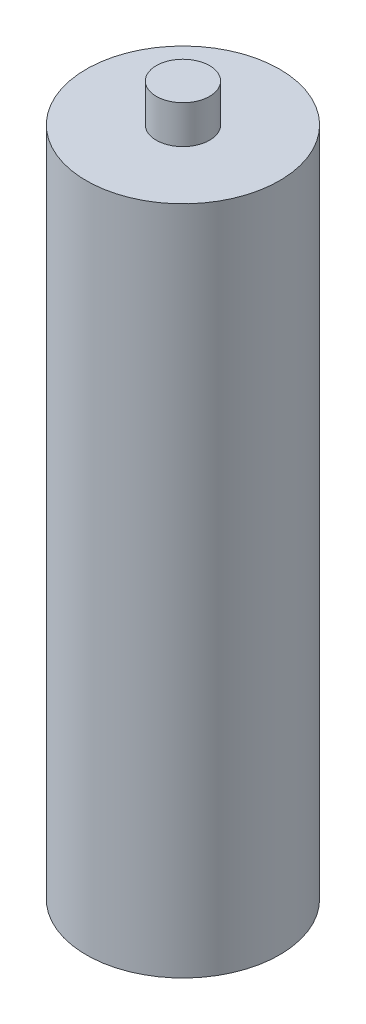
ISO-10303-21;
HEADER;
FILE_DESCRIPTION(('STEP AP214'),'2;1');
FILE_NAME('part.step','',(''),(''),'','','');
FILE_SCHEMA(('AUTOMOTIVE_DESIGN { 1 0 10303 214 1 1 1 1 }'));
ENDSEC;
DATA;
#1=APPLICATION_CONTEXT('core data for automotive mechanical design processes');
#2=APPLICATION_PROTOCOL_DEFINITION('international standard','automotive_design',2000,#1);
#3=PRODUCT_CONTEXT('',#1,'mechanical');
#4=PRODUCT('Part','Part','',(#3));
#5=PRODUCT_RELATED_PRODUCT_CATEGORY('part','',(#4));
#6=PRODUCT_DEFINITION_FORMATION('','',#4);
#7=PRODUCT_DEFINITION_CONTEXT('part definition',#1,'design');
#8=PRODUCT_DEFINITION('design','',#6,#7);
#9=PRODUCT_DEFINITION_SHAPE('','',#8);
#10=(LENGTH_UNIT() NAMED_UNIT(*) SI_UNIT(.MILLI.,.METRE.));
#11=(NAMED_UNIT(*) PLANE_ANGLE_UNIT() SI_UNIT($,.RADIAN.));
#12=(NAMED_UNIT(*) SI_UNIT($,.STERADIAN.) SOLID_ANGLE_UNIT());
#13=UNCERTAINTY_MEASURE_WITH_UNIT(LENGTH_MEASURE(1.E-05),#10,'distance_accuracy_value','');
#14=(GEOMETRIC_REPRESENTATION_CONTEXT(3) GLOBAL_UNCERTAINTY_ASSIGNED_CONTEXT((#13)) GLOBAL_UNIT_ASSIGNED_CONTEXT((#10,
#11,#12)) REPRESENTATION_CONTEXT('',''));
#15=CARTESIAN_POINT('',(0.,0.,0.));
#16=DIRECTION('',(0.,0.,1.));
#17=DIRECTION('',(1.,0.,0.));
#18=AXIS2_PLACEMENT_3D('',#15,#16,#17);
#19=CARTESIAN_POINT('',(0.,352.425,0.));
#20=DIRECTION('',(0.,-1.,0.));
#21=DIRECTION('',(0.,0.,-1.));
#22=AXIS2_PLACEMENT_3D('',#19,#20,#21);
#23=CYLINDRICAL_SURFACE('',#22,50.8);
#24=CARTESIAN_POINT('',(0.,352.425,0.));
#25=DIRECTION('',(0.,1.,0.));
#26=DIRECTION('',(0.,0.,1.));
#27=AXIS2_PLACEMENT_3D('',#24,#25,#26);
#28=CIRCLE('',#27,50.8);
#29=CARTESIAN_POINT('',(0.,352.425,-50.8));
#30=VERTEX_POINT('',#29);
#31=EDGE_CURVE('E53',#30,#30,#28,.T.);
#32=CARTESIAN_POINT('',(0.,0.,0.));
#33=DIRECTION('',(0.,1.,0.));
#34=DIRECTION('',(0.,0.,1.));
#35=AXIS2_PLACEMENT_3D('',#32,#33,#34);
#36=CIRCLE('',#35,50.8);
#37=CARTESIAN_POINT('',(0.,0.,-50.8));
#38=VERTEX_POINT('',#37);
#39=EDGE_CURVE('E48',#38,#38,#36,.T.);
#40=CARTESIAN_POINT('',(0.,352.425,-50.8));
#41=CARTESIAN_POINT('',(0.,348.75390625,-50.8));
#42=CARTESIAN_POINT('',(0.,345.0828125,-50.8));
#43=CARTESIAN_POINT('',(0.,337.740625,-50.8));
#44=CARTESIAN_POINT('',(0.,334.06953125,-50.8));
#45=CARTESIAN_POINT('',(0.,326.72734375,-50.8));
#46=CARTESIAN_POINT('',(0.,323.05625,-50.8));
#47=CARTESIAN_POINT('',(0.,315.7140625,-50.8));
#48=CARTESIAN_POINT('',(0.,312.04296875,-50.8));
#49=CARTESIAN_POINT('',(0.,304.70078125,-50.8));
#50=CARTESIAN_POINT('',(0.,301.0296875,-50.8));
#51=CARTESIAN_POINT('',(0.,293.6875,-50.8));
#52=CARTESIAN_POINT('',(0.,290.01640625,-50.8));
#53=CARTESIAN_POINT('',(0.,282.67421875,-50.8));
#54=CARTESIAN_POINT('',(0.,279.003125,-50.8));
#55=CARTESIAN_POINT('',(0.,271.6609375,-50.8));
#56=CARTESIAN_POINT('',(0.,267.98984375,-50.8));
#57=CARTESIAN_POINT('',(0.,260.64765625,-50.8));
#58=CARTESIAN_POINT('',(0.,256.9765625,-50.8));
#59=CARTESIAN_POINT('',(0.,249.634375,-50.8));
#60=CARTESIAN_POINT('',(0.,245.96328125,-50.8));
#61=CARTESIAN_POINT('',(0.,238.62109375,-50.8));
#62=CARTESIAN_POINT('',(0.,234.95,-50.8));
#63=CARTESIAN_POINT('',(0.,227.6078125,-50.8));
#64=CARTESIAN_POINT('',(0.,223.93671875,-50.8));
#65=CARTESIAN_POINT('',(0.,216.59453125,-50.8));
#66=CARTESIAN_POINT('',(0.,212.9234375,-50.8));
#67=CARTESIAN_POINT('',(0.,205.58125,-50.8));
#68=CARTESIAN_POINT('',(0.,201.91015625,-50.8));
#69=CARTESIAN_POINT('',(0.,194.56796875,-50.8));
#70=CARTESIAN_POINT('',(0.,190.896875,-50.8));
#71=CARTESIAN_POINT('',(0.,183.5546875,-50.8));
#72=CARTESIAN_POINT('',(0.,179.88359375,-50.8));
#73=CARTESIAN_POINT('',(0.,172.54140625,-50.8));
#74=CARTESIAN_POINT('',(0.,168.8703125,-50.8));
#75=CARTESIAN_POINT('',(0.,161.528125,-50.8));
#76=CARTESIAN_POINT('',(0.,157.85703125,-50.8));
#77=CARTESIAN_POINT('',(0.,150.51484375,-50.8));
#78=CARTESIAN_POINT('',(0.,146.84375,-50.8));
#79=CARTESIAN_POINT('',(0.,139.5015625,-50.8));
#80=CARTESIAN_POINT('',(0.,135.83046875,-50.8));
#81=CARTESIAN_POINT('',(0.,128.48828125,-50.8));
#82=CARTESIAN_POINT('',(0.,124.8171875,-50.8));
#83=CARTESIAN_POINT('',(0.,117.475,-50.8));
#84=CARTESIAN_POINT('',(0.,113.80390625,-50.8));
#85=CARTESIAN_POINT('',(0.,106.46171875,-50.8));
#86=CARTESIAN_POINT('',(0.,102.790625,-50.8));
#87=CARTESIAN_POINT('',(0.,95.4484375,-50.8));
#88=CARTESIAN_POINT('',(0.,91.77734375,-50.8));
#89=CARTESIAN_POINT('',(0.,84.43515625,-50.8));
#90=CARTESIAN_POINT('',(0.,80.7640625,-50.8));
#91=CARTESIAN_POINT('',(0.,73.421875,-50.8));
#92=CARTESIAN_POINT('',(0.,69.75078125,-50.8));
#93=CARTESIAN_POINT('',(0.,62.40859375,-50.8));
#94=CARTESIAN_POINT('',(0.,58.7375,-50.8));
#95=CARTESIAN_POINT('',(0.,51.3953125,-50.8));
#96=CARTESIAN_POINT('',(0.,47.72421875,-50.8));
#97=CARTESIAN_POINT('',(0.,40.38203125,-50.8));
#98=CARTESIAN_POINT('',(0.,36.7109375,-50.8));
#99=CARTESIAN_POINT('',(0.,29.36875,-50.8));
#100=CARTESIAN_POINT('',(0.,25.69765625,-50.8));
#101=CARTESIAN_POINT('',(0.,18.35546875,-50.8));
#102=CARTESIAN_POINT('',(0.,14.684375,-50.8));
#103=CARTESIAN_POINT('',(0.,7.34218749999995,-50.8));
#104=CARTESIAN_POINT('',(0.,3.67109374999995,-50.8));
#105=CARTESIAN_POINT('',(0.,0.,-50.8));
#106=B_SPLINE_CURVE_WITH_KNOTS('',3,(#40,#41,#42,#43,#44,#45,#46,#47,#48,#49,#50,#51,#52,#53,
#54,#55,#56,#57,#58,#59,#60,#61,#62,#63,#64,#65,#66,#67,#68,#69,#70,#71,#72,#73,#74,#75,#76,#77,
#78,#79,#80,#81,#82,#83,#84,#85,#86,#87,#88,#89,#90,#91,#92,#93,#94,#95,#96,#97,#98,#99,#100,
#101,#102,#103,#104,#105),.UNSPECIFIED.,.F.,.F.,(4,2,2,2,2,2,2,2,2,2,2,2,2,2,2,2,2,2,2,2,2,2,2,
2,2,2,2,2,2,2,2,2,4),(0.,11.01328125,22.0265625,33.03984375,44.053125,55.06640625,66.0796875,
77.09296875,88.10625,99.1195312500001,110.1328125,121.14609375,132.159375,143.17265625,
154.1859375,165.19921875,176.2125,187.22578125,198.2390625,209.25234375,220.265625,231.27890625,
242.2921875,253.30546875,264.31875,275.33203125,286.3453125,297.35859375,308.371875,
319.38515625,330.3984375,341.41171875,352.425),.UNSPECIFIED.);
#107=EDGE_CURVE('BSEAM45',#30,#38,#106,.T.);
#108=ORIENTED_EDGE('',*,*,#31,.F.);
#109=ORIENTED_EDGE('',*,*,#39,.T.);
#110=ORIENTED_EDGE('',*,*,#107,.T.);
#111=ORIENTED_EDGE('',*,*,#107,.F.);
#112=EDGE_LOOP('',(#108,#110,#109,#111));
#113=FACE_BOUND('',#112,.T.);
#114=ADVANCED_FACE('F45',(#113),#23,.T.);
#115=CARTESIAN_POINT('',(0.,352.425,0.));
#116=DIRECTION('',(0.,1.,0.));
#117=DIRECTION('',(0.,0.,1.));
#118=AXIS2_PLACEMENT_3D('',#115,#116,#117);
#119=PLANE('',#118);
#120=CARTESIAN_POINT('',(0.,352.425,0.));
#121=DIRECTION('',(0.,1.,0.));
#122=DIRECTION('',(0.,0.,1.));
#123=AXIS2_PLACEMENT_3D('',#120,#121,#122);
#124=CIRCLE('',#123,14.);
#125=CARTESIAN_POINT('',(0.,352.425,14.));
#126=VERTEX_POINT('',#125);
#127=EDGE_CURVE('E10',#126,#126,#124,.T.);
#128=ORIENTED_EDGE('',*,*,#127,.F.);
#129=EDGE_LOOP('',(#128));
#130=FACE_BOUND('',#129,.T.);
#131=ORIENTED_EDGE('',*,*,#31,.T.);
#132=EDGE_LOOP('',(#131));
#133=FACE_BOUND('',#132,.T.);
#134=ADVANCED_FACE('F73',(#130,#133),#119,.T.);
#135=CARTESIAN_POINT('',(0.,0.,0.));
#136=DIRECTION('',(0.,1.,0.));
#137=DIRECTION('',(0.,0.,1.));
#138=AXIS2_PLACEMENT_3D('',#135,#136,#137);
#139=PLANE('',#138);
#140=ORIENTED_EDGE('',*,*,#39,.F.);
#141=EDGE_LOOP('',(#140));
#142=FACE_BOUND('',#141,.T.);
#143=ADVANCED_FACE('F70',(#142),#139,.F.);
#144=CARTESIAN_POINT('',(0.,372.425,0.));
#145=DIRECTION('',(0.,-1.,0.));
#146=DIRECTION('',(0.,0.,-1.));
#147=AXIS2_PLACEMENT_3D('',#144,#145,#146);
#148=CYLINDRICAL_SURFACE('',#147,14.);
#149=CARTESIAN_POINT('',(0.,372.425,0.));
#150=DIRECTION('',(0.,1.,0.));
#151=DIRECTION('',(0.,0.,1.));
#152=AXIS2_PLACEMENT_3D('',#149,#150,#151);
#153=CIRCLE('',#152,14.);
#154=CARTESIAN_POINT('',(0.,372.425,14.));
#155=VERTEX_POINT('',#154);
#156=EDGE_CURVE('E60',#155,#155,#153,.T.);
#157=ORIENTED_EDGE('',*,*,#156,.F.);
#158=EDGE_LOOP('',(#157));
#159=FACE_BOUND('',#158,.T.);
#160=ORIENTED_EDGE('',*,*,#127,.T.);
#161=EDGE_LOOP('',(#160));
#162=FACE_BOUND('',#161,.T.);
#163=ADVANCED_FACE('F72',(#159,#162),#148,.T.);
#164=CARTESIAN_POINT('',(0.,372.425,0.));
#165=DIRECTION('',(0.,1.,0.));
#166=DIRECTION('',(0.,0.,1.));
#167=AXIS2_PLACEMENT_3D('',#164,#165,#166);
#168=PLANE('',#167);
#169=ORIENTED_EDGE('',*,*,#156,.T.);
#170=EDGE_LOOP('',(#169));
#171=FACE_BOUND('',#170,.T.);
#172=ADVANCED_FACE('F79',(#171),#168,.T.);
#173=CLOSED_SHELL('',(#114,#134,#143,#163,#172));
#174=MANIFOLD_SOLID_BREP('B2',#173);
#175=ADVANCED_BREP_SHAPE_REPRESENTATION('',(#18,#174),#14);
#176=SHAPE_DEFINITION_REPRESENTATION(#9,#175);
ENDSEC;
END-ISO-10303-21;
